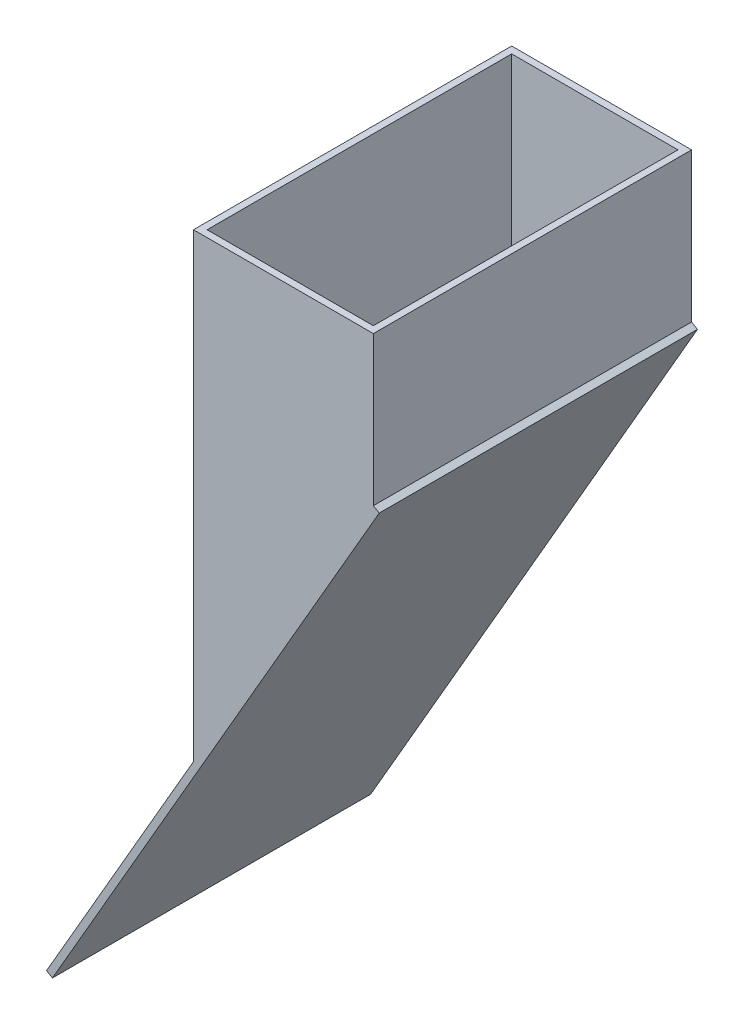
ISO-10303-21;
HEADER;
FILE_DESCRIPTION(('STEP AP214'),'2;1');
FILE_NAME('part.step','',(''),(''),'','','');
FILE_SCHEMA(('AUTOMOTIVE_DESIGN { 1 0 10303 214 1 1 1 1 }'));
ENDSEC;
DATA;
#1=APPLICATION_CONTEXT('core data for automotive mechanical design processes');
#2=APPLICATION_PROTOCOL_DEFINITION('international standard','automotive_design',2000,#1);
#3=PRODUCT_CONTEXT('',#1,'mechanical');
#4=PRODUCT('Part','Part','',(#3));
#5=PRODUCT_RELATED_PRODUCT_CATEGORY('part','',(#4));
#6=PRODUCT_DEFINITION_FORMATION('','',#4);
#7=PRODUCT_DEFINITION_CONTEXT('part definition',#1,'design');
#8=PRODUCT_DEFINITION('design','',#6,#7);
#9=PRODUCT_DEFINITION_SHAPE('','',#8);
#10=(LENGTH_UNIT() NAMED_UNIT(*) SI_UNIT(.MILLI.,.METRE.));
#11=(NAMED_UNIT(*) PLANE_ANGLE_UNIT() SI_UNIT($,.RADIAN.));
#12=(NAMED_UNIT(*) SI_UNIT($,.STERADIAN.) SOLID_ANGLE_UNIT());
#13=UNCERTAINTY_MEASURE_WITH_UNIT(LENGTH_MEASURE(1.E-05),#10,'distance_accuracy_value','');
#14=(GEOMETRIC_REPRESENTATION_CONTEXT(3) GLOBAL_UNCERTAINTY_ASSIGNED_CONTEXT((#13)) GLOBAL_UNIT_ASSIGNED_CONTEXT((#10,
#11,#12)) REPRESENTATION_CONTEXT('',''));
#15=CARTESIAN_POINT('',(0.,0.,0.));
#16=DIRECTION('',(0.,0.,1.));
#17=DIRECTION('',(1.,0.,0.));
#18=AXIS2_PLACEMENT_3D('',#15,#16,#17);
#19=CARTESIAN_POINT('',(-83.85,-795.454931873796,-148.35));
#20=DIRECTION('',(0.,0.,-1.));
#21=DIRECTION('',(-1.,0.,0.));
#22=AXIS2_PLACEMENT_3D('',#19,#20,#21);
#23=PLANE('',#22);
#24=DIRECTION('',(0.,1.,0.));
#25=VECTOR('',#24,1.);
#26=CARTESIAN_POINT('',(83.8500000000001,-795.454931873796,-148.35));
#27=LINE('',#26,#25);
#28=CARTESIAN_POINT('',(83.8500000000001,-139.001477371937,-148.35));
#29=VERTEX_POINT('',#28);
#30=CARTESIAN_POINT('',(83.8500000000001,0.,-148.35));
#31=VERTEX_POINT('',#30);
#32=EDGE_CURVE('E180',#29,#31,#27,.T.);
#33=ORIENTED_EDGE('',*,*,#32,.F.);
#34=DIRECTION('',(-0.86602540378444,0.499999999999998,0.));
#35=VECTOR('',#34,1.);
#36=CARTESIAN_POINT('',(89.3492613140313,-142.176477371937,-148.35));
#37=LINE('',#36,#35);
#38=CARTESIAN_POINT('',(89.3492613140313,-142.176477371937,-148.35));
#39=VERTEX_POINT('',#38);
#40=EDGE_CURVE('E212',#39,#29,#37,.T.);
#41=ORIENTED_EDGE('',*,*,#40,.F.);
#42=DIRECTION('',(-0.499999999999998,-0.86602540378444,0.));
#43=VECTOR('',#42,1.);
#44=CARTESIAN_POINT('',(-215.350738685968,-669.932358438176,-148.35));
#45=LINE('',#44,#43);
#46=CARTESIAN_POINT('',(-215.350738685968,-669.932358438176,-148.35));
#47=VERTEX_POINT('',#46);
#48=EDGE_CURVE('E288',#39,#47,#45,.T.);
#49=ORIENTED_EDGE('',*,*,#48,.T.);
#50=DIRECTION('',(-0.86602540378444,0.499999999999998,0.));
#51=VECTOR('',#50,1.);
#52=CARTESIAN_POINT('',(-215.350738685968,-669.932358438176,-148.35));
#53=LINE('',#52,#51);
#54=CARTESIAN_POINT('',(-220.849999999999,-666.757358438176,-148.35));
#55=VERTEX_POINT('',#54);
#56=EDGE_CURVE('E282',#47,#55,#53,.T.);
#57=ORIENTED_EDGE('',*,*,#56,.T.);
#58=DIRECTION('',(-0.499999999999998,-0.86602540378444,0.));
#59=VECTOR('',#58,1.);
#60=CARTESIAN_POINT('',(-220.849999999999,-666.757358438176,-148.35));
#61=LINE('',#60,#59);
#62=CARTESIAN_POINT('',(-83.85,-429.46639780124,-148.35));
#63=VERTEX_POINT('',#62);
#64=EDGE_CURVE('E286',#63,#55,#61,.T.);
#65=ORIENTED_EDGE('',*,*,#64,.F.);
#66=DIRECTION('',(0.,1.,0.));
#67=VECTOR('',#66,1.);
#68=CARTESIAN_POINT('',(-83.85,-795.454931873796,-148.35));
#69=LINE('',#68,#67);
#70=CARTESIAN_POINT('',(-83.85,0.,-148.35));
#71=VERTEX_POINT('',#70);
#72=EDGE_CURVE('E185',#63,#71,#69,.T.);
#73=ORIENTED_EDGE('',*,*,#72,.T.);
#74=DIRECTION('',(-1.,0.,0.));
#75=VECTOR('',#74,1.);
#76=CARTESIAN_POINT('',(-83.85,0.,-148.35));
#77=LINE('',#76,#75);
#78=EDGE_CURVE('E170',#31,#71,#77,.T.);
#79=ORIENTED_EDGE('',*,*,#78,.F.);
#80=EDGE_LOOP('',(#33,#41,#49,#57,#65,#73,#79));
#81=FACE_BOUND('',#80,.T.);
#82=ADVANCED_FACE('F41',(#81),#23,.T.);
#83=CARTESIAN_POINT('',(-83.85,-795.454931873796,-148.35));
#84=DIRECTION('',(-1.,0.,0.));
#85=DIRECTION('',(0.,0.,1.));
#86=AXIS2_PLACEMENT_3D('',#83,#84,#85);
#87=PLANE('',#86);
#88=DIRECTION('',(0.,-1.,0.));
#89=VECTOR('',#88,1.);
#90=CARTESIAN_POINT('',(-83.85,-429.466397801237,-142.));
#91=LINE('',#90,#89);
#92=CARTESIAN_POINT('',(-83.85,-333.467875173178,-142.));
#93=VERTEX_POINT('',#92);
#94=CARTESIAN_POINT('',(-83.85,-429.46639780124,-142.));
#95=VERTEX_POINT('',#94);
#96=EDGE_CURVE('E290',#93,#95,#91,.T.);
#97=ORIENTED_EDGE('',*,*,#96,.F.);
#98=DIRECTION('',(0.,0.,1.));
#99=VECTOR('',#98,1.);
#100=CARTESIAN_POINT('',(-83.85,-333.467875173178,-238.208309655508));
#101=LINE('',#100,#99);
#102=CARTESIAN_POINT('',(-83.85,-333.467875173178,142.));
#103=VERTEX_POINT('',#102);
#104=EDGE_CURVE('E304',#93,#103,#101,.T.);
#105=ORIENTED_EDGE('',*,*,#104,.T.);
#106=DIRECTION('',(0.,-1.,0.));
#107=VECTOR('',#106,1.);
#108=CARTESIAN_POINT('',(-83.85,-429.466397801237,142.));
#109=LINE('',#108,#107);
#110=CARTESIAN_POINT('',(-83.85,-429.466397801237,142.));
#111=VERTEX_POINT('',#110);
#112=EDGE_CURVE('E144',#103,#111,#109,.T.);
#113=ORIENTED_EDGE('',*,*,#112,.T.);
#114=DIRECTION('',(0.,0.,-1.));
#115=VECTOR('',#114,1.);
#116=CARTESIAN_POINT('',(-83.85,-429.46639780124,-148.35));
#117=LINE('',#116,#115);
#118=CARTESIAN_POINT('',(-83.8499999999999,-429.46639780124,148.35));
#119=VERTEX_POINT('',#118);
#120=EDGE_CURVE('E216',#119,#111,#117,.T.);
#121=ORIENTED_EDGE('',*,*,#120,.F.);
#122=DIRECTION('',(0.,1.,0.));
#123=VECTOR('',#122,1.);
#124=CARTESIAN_POINT('',(-83.85,-795.454931873796,148.35));
#125=LINE('',#124,#123);
#126=CARTESIAN_POINT('',(-83.85,0.,148.35));
#127=VERTEX_POINT('',#126);
#128=EDGE_CURVE('E183',#119,#127,#125,.T.);
#129=ORIENTED_EDGE('',*,*,#128,.T.);
#130=DIRECTION('',(0.,0.,1.));
#131=VECTOR('',#130,1.);
#132=CARTESIAN_POINT('',(-83.85,0.,-148.35));
#133=LINE('',#132,#131);
#134=EDGE_CURVE('E173',#71,#127,#133,.T.);
#135=ORIENTED_EDGE('',*,*,#134,.F.);
#136=ORIENTED_EDGE('',*,*,#72,.F.);
#137=EDGE_CURVE('E220',#95,#63,#117,.T.);
#138=ORIENTED_EDGE('',*,*,#137,.F.);
#139=EDGE_LOOP('',(#97,#105,#113,#121,#129,#135,#136,#138));
#140=FACE_BOUND('',#139,.T.);
#141=ADVANCED_FACE('F249',(#140),#87,.T.);
#142=CARTESIAN_POINT('',(-83.85,-795.454931873796,148.35));
#143=DIRECTION('',(0.,0.,1.));
#144=DIRECTION('',(1.,0.,0.));
#145=AXIS2_PLACEMENT_3D('',#142,#143,#144);
#146=PLANE('',#145);
#147=ORIENTED_EDGE('',*,*,#128,.F.);
#148=DIRECTION('',(0.499999999999998,0.86602540378444,0.));
#149=VECTOR('',#148,1.);
#150=CARTESIAN_POINT('',(-220.849999999999,-666.757358438176,148.35));
#151=LINE('',#150,#149);
#152=CARTESIAN_POINT('',(-220.849999999999,-666.757358438176,148.35));
#153=VERTEX_POINT('',#152);
#154=EDGE_CURVE('E285',#153,#119,#151,.T.);
#155=ORIENTED_EDGE('',*,*,#154,.F.);
#156=DIRECTION('',(-0.86602540378444,0.499999999999998,0.));
#157=VECTOR('',#156,1.);
#158=CARTESIAN_POINT('',(-215.350738685968,-669.932358438176,148.35));
#159=LINE('',#158,#157);
#160=CARTESIAN_POINT('',(-215.350738685968,-669.932358438176,148.35));
#161=VERTEX_POINT('',#160);
#162=EDGE_CURVE('E213',#161,#153,#159,.T.);
#163=ORIENTED_EDGE('',*,*,#162,.F.);
#164=DIRECTION('',(0.499999999999998,0.86602540378444,0.));
#165=VECTOR('',#164,1.);
#166=CARTESIAN_POINT('',(-215.350738685968,-669.932358438176,148.35));
#167=LINE('',#166,#165);
#168=CARTESIAN_POINT('',(89.3492613140313,-142.176477371937,148.35));
#169=VERTEX_POINT('',#168);
#170=EDGE_CURVE('E208',#161,#169,#167,.T.);
#171=ORIENTED_EDGE('',*,*,#170,.T.);
#172=DIRECTION('',(-0.86602540378444,0.499999999999998,0.));
#173=VECTOR('',#172,1.);
#174=CARTESIAN_POINT('',(89.3492613140313,-142.176477371937,148.35));
#175=LINE('',#174,#173);
#176=CARTESIAN_POINT('',(83.8500000000001,-139.001477371937,148.35));
#177=VERTEX_POINT('',#176);
#178=EDGE_CURVE('E206',#169,#177,#175,.T.);
#179=ORIENTED_EDGE('',*,*,#178,.T.);
#180=DIRECTION('',(0.,1.,0.));
#181=VECTOR('',#180,1.);
#182=CARTESIAN_POINT('',(83.8500000000001,-795.454931873796,148.35));
#183=LINE('',#182,#181);
#184=CARTESIAN_POINT('',(83.8500000000001,0.,148.35));
#185=VERTEX_POINT('',#184);
#186=EDGE_CURVE('E181',#177,#185,#183,.T.);
#187=ORIENTED_EDGE('',*,*,#186,.T.);
#188=DIRECTION('',(1.,0.,0.));
#189=VECTOR('',#188,1.);
#190=CARTESIAN_POINT('',(-83.85,0.,148.35));
#191=LINE('',#190,#189);
#192=EDGE_CURVE('E176',#127,#185,#191,.T.);
#193=ORIENTED_EDGE('',*,*,#192,.F.);
#194=EDGE_LOOP('',(#147,#155,#163,#171,#179,#187,#193));
#195=FACE_BOUND('',#194,.T.);
#196=ADVANCED_FACE('F201',(#195),#146,.T.);
#197=CARTESIAN_POINT('',(83.8500000000001,-795.454931873796,-148.35));
#198=DIRECTION('',(1.,0.,0.));
#199=DIRECTION('',(0.,0.,-1.));
#200=AXIS2_PLACEMENT_3D('',#197,#198,#199);
#201=PLANE('',#200);
#202=DIRECTION('',(0.,0.,1.));
#203=VECTOR('',#202,1.);
#204=CARTESIAN_POINT('',(83.8500000000001,-139.001477371937,-148.35));
#205=LINE('',#204,#203);
#206=EDGE_CURVE('E191',#29,#177,#205,.T.);
#207=ORIENTED_EDGE('',*,*,#206,.F.);
#208=ORIENTED_EDGE('',*,*,#32,.T.);
#209=DIRECTION('',(0.,0.,-1.));
#210=VECTOR('',#209,1.);
#211=CARTESIAN_POINT('',(83.8500000000001,0.,-148.35));
#212=LINE('',#211,#210);
#213=EDGE_CURVE('E160',#185,#31,#212,.T.);
#214=ORIENTED_EDGE('',*,*,#213,.F.);
#215=ORIENTED_EDGE('',*,*,#186,.F.);
#216=EDGE_LOOP('',(#207,#208,#214,#215));
#217=FACE_BOUND('',#216,.T.);
#218=ADVANCED_FACE('F43',(#217),#201,.T.);
#219=CARTESIAN_POINT('',(0.,0.,0.));
#220=DIRECTION('',(0.,1.,0.));
#221=DIRECTION('',(0.,0.,1.));
#222=AXIS2_PLACEMENT_3D('',#219,#220,#221);
#223=PLANE('',#222);
#224=DIRECTION('',(0.,0.,-1.));
#225=VECTOR('',#224,1.);
#226=CARTESIAN_POINT('',(77.5,0.,-142.));
#227=LINE('',#226,#225);
#228=CARTESIAN_POINT('',(77.5,0.,142.));
#229=VERTEX_POINT('',#228);
#230=CARTESIAN_POINT('',(77.5,0.,-142.));
#231=VERTEX_POINT('',#230);
#232=EDGE_CURVE('E223',#229,#231,#227,.T.);
#233=ORIENTED_EDGE('',*,*,#232,.F.);
#234=DIRECTION('',(1.,0.,0.));
#235=VECTOR('',#234,1.);
#236=CARTESIAN_POINT('',(-77.5,0.,142.));
#237=LINE('',#236,#235);
#238=CARTESIAN_POINT('',(-77.5,0.,142.));
#239=VERTEX_POINT('',#238);
#240=EDGE_CURVE('E167',#239,#229,#237,.T.);
#241=ORIENTED_EDGE('',*,*,#240,.F.);
#242=DIRECTION('',(0.,0.,1.));
#243=VECTOR('',#242,1.);
#244=CARTESIAN_POINT('',(-77.5,0.,-142.));
#245=LINE('',#244,#243);
#246=CARTESIAN_POINT('',(-77.5,0.,-142.));
#247=VERTEX_POINT('',#246);
#248=EDGE_CURVE('E155',#247,#239,#245,.T.);
#249=ORIENTED_EDGE('',*,*,#248,.F.);
#250=DIRECTION('',(-1.,0.,0.));
#251=VECTOR('',#250,1.);
#252=CARTESIAN_POINT('',(-77.5,0.,-142.));
#253=LINE('',#252,#251);
#254=EDGE_CURVE('E226',#231,#247,#253,.T.);
#255=ORIENTED_EDGE('',*,*,#254,.F.);
#256=EDGE_LOOP('',(#233,#241,#249,#255));
#257=FACE_BOUND('',#256,.T.);
#258=ORIENTED_EDGE('',*,*,#213,.T.);
#259=ORIENTED_EDGE('',*,*,#78,.T.);
#260=ORIENTED_EDGE('',*,*,#134,.T.);
#261=ORIENTED_EDGE('',*,*,#192,.T.);
#262=EDGE_LOOP('',(#258,#259,#260,#261));
#263=FACE_BOUND('',#262,.T.);
#264=ADVANCED_FACE('F198',(#257,#263),#223,.T.);
#265=CARTESIAN_POINT('',(-77.5,-795.454931873796,-142.));
#266=DIRECTION('',(0.,0.,-1.));
#267=DIRECTION('',(-1.,0.,0.));
#268=AXIS2_PLACEMENT_3D('',#265,#266,#267);
#269=PLANE('',#268);
#270=DIRECTION('',(0.,1.,0.));
#271=VECTOR('',#270,1.);
#272=CARTESIAN_POINT('',(-77.5,-795.454931873796,-142.));
#273=LINE('',#272,#271);
#274=CARTESIAN_POINT('',(-77.5,-333.467875173178,-142.));
#275=VERTEX_POINT('',#274);
#276=EDGE_CURVE('E158',#275,#247,#273,.T.);
#277=ORIENTED_EDGE('',*,*,#276,.F.);
#278=DIRECTION('',(-1.,0.,0.));
#279=VECTOR('',#278,1.);
#280=CARTESIAN_POINT('',(-83.85,-333.467875173178,-142.));
#281=LINE('',#280,#279);
#282=EDGE_CURVE('E140',#275,#93,#281,.T.);
#283=ORIENTED_EDGE('',*,*,#282,.T.);
#284=ORIENTED_EDGE('',*,*,#96,.T.);
#285=DIRECTION('',(0.499999999999998,0.86602540378444,0.));
#286=VECTOR('',#285,1.);
#287=CARTESIAN_POINT('',(-240.74018400033,-701.208167698642,-142.));
#288=LINE('',#287,#286);
#289=CARTESIAN_POINT('',(77.5,-150.,-142.));
#290=VERTEX_POINT('',#289);
#291=EDGE_CURVE('E45',#95,#290,#288,.T.);
#292=ORIENTED_EDGE('',*,*,#291,.T.);
#293=DIRECTION('',(0.,1.,0.));
#294=VECTOR('',#293,1.);
#295=CARTESIAN_POINT('',(77.5,-795.454931873796,-142.));
#296=LINE('',#295,#294);
#297=EDGE_CURVE('E162',#290,#231,#296,.T.);
#298=ORIENTED_EDGE('',*,*,#297,.T.);
#299=ORIENTED_EDGE('',*,*,#254,.T.);
#300=EDGE_LOOP('',(#277,#283,#284,#292,#298,#299));
#301=FACE_BOUND('',#300,.T.);
#302=ADVANCED_FACE('F260',(#301),#269,.F.);
#303=CARTESIAN_POINT('',(-77.5,-795.454931873796,-142.));
#304=DIRECTION('',(-1.,0.,0.));
#305=DIRECTION('',(0.,0.,1.));
#306=AXIS2_PLACEMENT_3D('',#303,#304,#305);
#307=PLANE('',#306);
#308=DIRECTION('',(0.,1.,0.));
#309=VECTOR('',#308,1.);
#310=CARTESIAN_POINT('',(-77.5,-795.454931873796,142.));
#311=LINE('',#310,#309);
#312=CARTESIAN_POINT('',(-77.5,-333.467875173178,142.));
#313=VERTEX_POINT('',#312);
#314=EDGE_CURVE('E149',#313,#239,#311,.T.);
#315=ORIENTED_EDGE('',*,*,#314,.F.);
#316=DIRECTION('',(0.,0.,1.));
#317=VECTOR('',#316,1.);
#318=CARTESIAN_POINT('',(-77.5,-333.467875173178,-238.208309655508));
#319=LINE('',#318,#317);
#320=EDGE_CURVE('E134',#275,#313,#319,.T.);
#321=ORIENTED_EDGE('',*,*,#320,.F.);
#322=ORIENTED_EDGE('',*,*,#276,.T.);
#323=ORIENTED_EDGE('',*,*,#248,.T.);
#324=EDGE_LOOP('',(#315,#321,#322,#323));
#325=FACE_BOUND('',#324,.T.);
#326=ADVANCED_FACE('F153',(#325),#307,.F.);
#327=CARTESIAN_POINT('',(-77.5,-795.454931873796,142.));
#328=DIRECTION('',(0.,0.,1.));
#329=DIRECTION('',(1.,0.,0.));
#330=AXIS2_PLACEMENT_3D('',#327,#328,#329);
#331=PLANE('',#330);
#332=DIRECTION('',(0.,1.,0.));
#333=VECTOR('',#332,1.);
#334=CARTESIAN_POINT('',(77.5,-795.454931873796,142.));
#335=LINE('',#334,#333);
#336=CARTESIAN_POINT('',(77.5,-150.,142.));
#337=VERTEX_POINT('',#336);
#338=EDGE_CURVE('E157',#337,#229,#335,.T.);
#339=ORIENTED_EDGE('',*,*,#338,.F.);
#340=DIRECTION('',(-0.499999999999998,-0.86602540378444,0.));
#341=VECTOR('',#340,1.);
#342=CARTESIAN_POINT('',(-240.74018400033,-701.208167698642,142.));
#343=LINE('',#342,#341);
#344=EDGE_CURVE('E11',#337,#111,#343,.T.);
#345=ORIENTED_EDGE('',*,*,#344,.T.);
#346=ORIENTED_EDGE('',*,*,#112,.F.);
#347=DIRECTION('',(-1.,0.,0.));
#348=VECTOR('',#347,1.);
#349=CARTESIAN_POINT('',(-83.85,-333.467875173178,142.));
#350=LINE('',#349,#348);
#351=EDGE_CURVE('E137',#313,#103,#350,.T.);
#352=ORIENTED_EDGE('',*,*,#351,.F.);
#353=ORIENTED_EDGE('',*,*,#314,.T.);
#354=ORIENTED_EDGE('',*,*,#240,.T.);
#355=EDGE_LOOP('',(#339,#345,#346,#352,#353,#354));
#356=FACE_BOUND('',#355,.T.);
#357=ADVANCED_FACE('F147',(#356),#331,.F.);
#358=CARTESIAN_POINT('',(77.5,-795.454931873796,-142.));
#359=DIRECTION('',(1.,0.,0.));
#360=DIRECTION('',(0.,0.,-1.));
#361=AXIS2_PLACEMENT_3D('',#358,#359,#360);
#362=PLANE('',#361);
#363=ORIENTED_EDGE('',*,*,#297,.F.);
#364=DIRECTION('',(0.,0.,1.));
#365=VECTOR('',#364,1.);
#366=CARTESIAN_POINT('',(77.5,-150.,-142.));
#367=LINE('',#366,#365);
#368=EDGE_CURVE('E50',#290,#337,#367,.T.);
#369=ORIENTED_EDGE('',*,*,#368,.T.);
#370=ORIENTED_EDGE('',*,*,#338,.T.);
#371=ORIENTED_EDGE('',*,*,#232,.T.);
#372=EDGE_LOOP('',(#363,#369,#370,#371));
#373=FACE_BOUND('',#372,.T.);
#374=ADVANCED_FACE('F236',(#373),#362,.F.);
#375=CARTESIAN_POINT('',(128.576166597864,-74.2334843966466,0.));
#376=DIRECTION('',(0.86602540378444,-0.499999999999998,0.));
#377=DIRECTION('',(0.499999999999998,0.86602540378444,0.));
#378=AXIS2_PLACEMENT_3D('',#375,#376,#377);
#379=PLANE('',#378);
#380=ORIENTED_EDGE('',*,*,#48,.F.);
#381=DIRECTION('',(0.,0.,-1.));
#382=VECTOR('',#381,1.);
#383=CARTESIAN_POINT('',(89.3492613140313,-142.176477371937,-148.35));
#384=LINE('',#383,#382);
#385=EDGE_CURVE('E296',#169,#39,#384,.T.);
#386=ORIENTED_EDGE('',*,*,#385,.F.);
#387=ORIENTED_EDGE('',*,*,#170,.F.);
#388=DIRECTION('',(0.,0.,1.));
#389=VECTOR('',#388,1.);
#390=CARTESIAN_POINT('',(-215.350738685968,-669.932358438176,-148.35));
#391=LINE('',#390,#389);
#392=EDGE_CURVE('E298',#47,#161,#391,.T.);
#393=ORIENTED_EDGE('',*,*,#392,.F.);
#394=EDGE_LOOP('',(#380,#386,#387,#393));
#395=FACE_BOUND('',#394,.T.);
#396=ADVANCED_FACE('F263',(#395),#379,.T.);
#397=CARTESIAN_POINT('',(-215.350738685968,-669.932358438176,-148.35));
#398=DIRECTION('',(-0.499999999999998,-0.86602540378444,0.));
#399=DIRECTION('',(0.86602540378444,-0.499999999999998,0.));
#400=AXIS2_PLACEMENT_3D('',#397,#398,#399);
#401=PLANE('',#400);
#402=DIRECTION('',(0.,0.,1.));
#403=VECTOR('',#402,1.);
#404=CARTESIAN_POINT('',(-220.849999999999,-666.757358438176,-148.35));
#405=LINE('',#404,#403);
#406=EDGE_CURVE('E279',#55,#153,#405,.T.);
#407=ORIENTED_EDGE('',*,*,#406,.F.);
#408=ORIENTED_EDGE('',*,*,#56,.F.);
#409=ORIENTED_EDGE('',*,*,#392,.T.);
#410=ORIENTED_EDGE('',*,*,#162,.T.);
#411=EDGE_LOOP('',(#407,#408,#409,#410));
#412=FACE_BOUND('',#411,.T.);
#413=ADVANCED_FACE('F245',(#412),#401,.T.);
#414=CARTESIAN_POINT('',(89.3492613140313,-142.176477371937,-148.35));
#415=DIRECTION('',(0.499999999999998,0.86602540378444,0.));
#416=DIRECTION('',(-0.86602540378444,0.499999999999998,0.));
#417=AXIS2_PLACEMENT_3D('',#414,#415,#416);
#418=PLANE('',#417);
#419=ORIENTED_EDGE('',*,*,#206,.T.);
#420=ORIENTED_EDGE('',*,*,#178,.F.);
#421=ORIENTED_EDGE('',*,*,#385,.T.);
#422=ORIENTED_EDGE('',*,*,#40,.T.);
#423=EDGE_LOOP('',(#419,#420,#421,#422));
#424=FACE_BOUND('',#423,.T.);
#425=ADVANCED_FACE('F215',(#424),#418,.T.);
#426=CARTESIAN_POINT('',(123.076905283833,-71.0584843966466,0.));
#427=DIRECTION('',(0.86602540378444,-0.499999999999998,0.));
#428=DIRECTION('',(0.499999999999998,0.86602540378444,0.));
#429=AXIS2_PLACEMENT_3D('',#426,#427,#428);
#430=PLANE('',#429);
#431=ORIENTED_EDGE('',*,*,#368,.F.);
#432=ORIENTED_EDGE('',*,*,#291,.F.);
#433=ORIENTED_EDGE('',*,*,#137,.T.);
#434=ORIENTED_EDGE('',*,*,#64,.T.);
#435=ORIENTED_EDGE('',*,*,#406,.T.);
#436=ORIENTED_EDGE('',*,*,#154,.T.);
#437=ORIENTED_EDGE('',*,*,#120,.T.);
#438=ORIENTED_EDGE('',*,*,#344,.F.);
#439=EDGE_LOOP('',(#431,#432,#433,#434,#435,#436,#437,#438));
#440=FACE_BOUND('',#439,.T.);
#441=ADVANCED_FACE('F237',(#440),#430,.F.);
#442=CARTESIAN_POINT('',(-83.85,-333.467875173178,-238.208309655508));
#443=DIRECTION('',(0.,1.,0.));
#444=DIRECTION('',(0.,0.,1.));
#445=AXIS2_PLACEMENT_3D('',#442,#443,#444);
#446=PLANE('',#445);
#447=ORIENTED_EDGE('',*,*,#320,.T.);
#448=ORIENTED_EDGE('',*,*,#351,.T.);
#449=ORIENTED_EDGE('',*,*,#104,.F.);
#450=ORIENTED_EDGE('',*,*,#282,.F.);
#451=EDGE_LOOP('',(#447,#448,#449,#450));
#452=FACE_BOUND('',#451,.T.);
#453=ADVANCED_FACE('F136',(#452),#446,.F.);
#454=CLOSED_SHELL('',(#82,#141,#196,#218,#264,#302,#326,#357,#374,#396,#413,#425,#441,#453));
#455=MANIFOLD_SOLID_BREP('B2',#454);
#456=ADVANCED_BREP_SHAPE_REPRESENTATION('',(#18,#455),#14);
#457=SHAPE_DEFINITION_REPRESENTATION(#9,#456);
ENDSEC;
END-ISO-10303-21;
